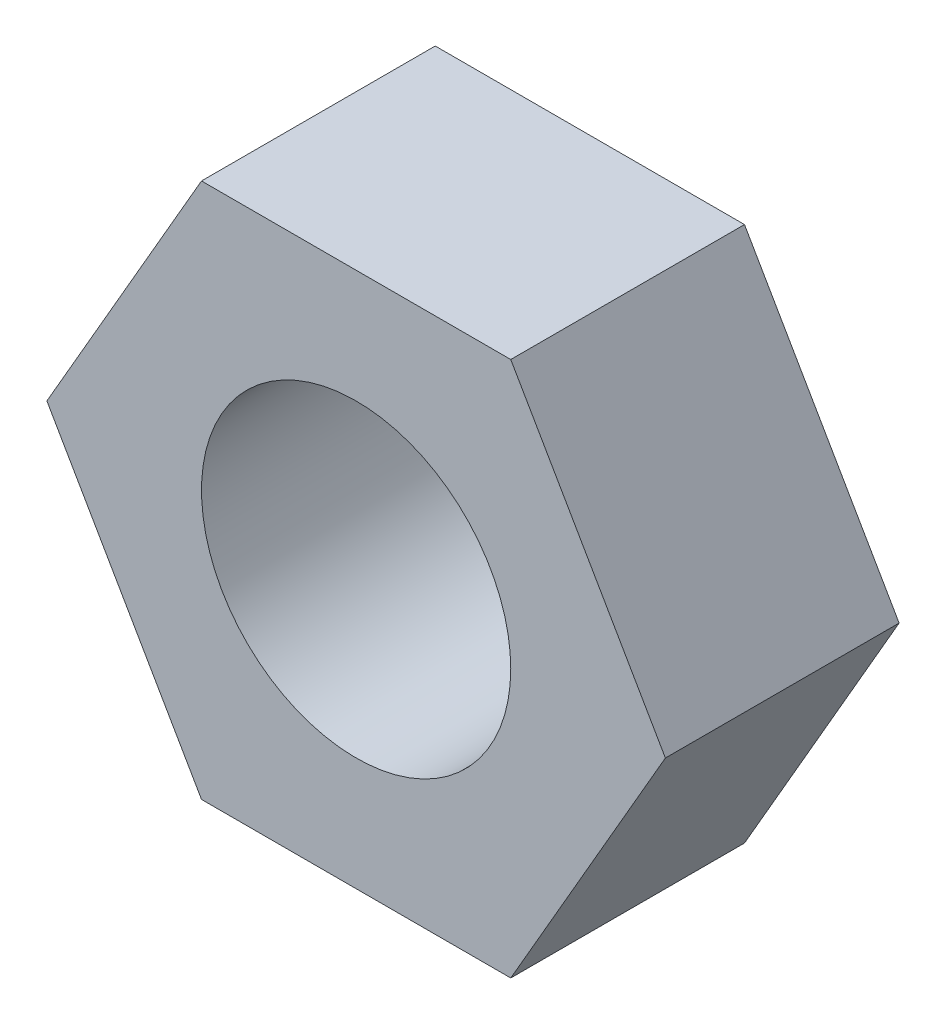
ISO-10303-21;
HEADER;
FILE_DESCRIPTION(('STEP AP214'),'2;1');
FILE_NAME('part.step','',(''),(''),'','','');
FILE_SCHEMA(('AUTOMOTIVE_DESIGN { 1 0 10303 214 1 1 1 1 }'));
ENDSEC;
DATA;
#1=APPLICATION_CONTEXT('core data for automotive mechanical design processes');
#2=APPLICATION_PROTOCOL_DEFINITION('international standard','automotive_design',2000,#1);
#3=PRODUCT_CONTEXT('',#1,'mechanical');
#4=PRODUCT('Part','Part','',(#3));
#5=PRODUCT_RELATED_PRODUCT_CATEGORY('part','',(#4));
#6=PRODUCT_DEFINITION_FORMATION('','',#4);
#7=PRODUCT_DEFINITION_CONTEXT('part definition',#1,'design');
#8=PRODUCT_DEFINITION('design','',#6,#7);
#9=PRODUCT_DEFINITION_SHAPE('','',#8);
#10=(LENGTH_UNIT() NAMED_UNIT(*) SI_UNIT(.MILLI.,.METRE.));
#11=(NAMED_UNIT(*) PLANE_ANGLE_UNIT() SI_UNIT($,.RADIAN.));
#12=(NAMED_UNIT(*) SI_UNIT($,.STERADIAN.) SOLID_ANGLE_UNIT());
#13=UNCERTAINTY_MEASURE_WITH_UNIT(LENGTH_MEASURE(1.E-05),#10,'distance_accuracy_value','');
#14=(GEOMETRIC_REPRESENTATION_CONTEXT(3) GLOBAL_UNCERTAINTY_ASSIGNED_CONTEXT((#13)) GLOBAL_UNIT_ASSIGNED_CONTEXT((#10,
#11,#12)) REPRESENTATION_CONTEXT('',''));
#15=CARTESIAN_POINT('',(0.,0.,0.));
#16=DIRECTION('',(0.,0.,1.));
#17=DIRECTION('',(1.,0.,0.));
#18=AXIS2_PLACEMENT_3D('',#15,#16,#17);
#19=CARTESIAN_POINT('',(0.,0.,2.4));
#20=DIRECTION('',(0.,0.,1.));
#21=DIRECTION('',(1.,0.,0.));
#22=AXIS2_PLACEMENT_3D('',#19,#20,#21);
#23=PLANE('',#22);
#24=DIRECTION('',(0.499999999999995,0.866025403784442,0.));
#25=VECTOR('',#24,1.);
#26=CARTESIAN_POINT('',(1.5877132402715,-2.74999999999998,2.4));
#27=LINE('',#26,#25);
#28=CARTESIAN_POINT('',(1.5877132402715,-2.74999999999998,2.4));
#29=VERTEX_POINT('',#28);
#30=CARTESIAN_POINT('',(3.17542648054294,0.,2.4));
#31=VERTEX_POINT('',#30);
#32=EDGE_CURVE('E131',#29,#31,#27,.T.);
#33=ORIENTED_EDGE('',*,*,#32,.T.);
#34=DIRECTION('',(-0.500000000000001,0.866025403784438,0.));
#35=VECTOR('',#34,1.);
#36=CARTESIAN_POINT('',(3.17542648054294,0.,2.4));
#37=LINE('',#36,#35);
#38=CARTESIAN_POINT('',(1.58771324027146,2.75,2.4));
#39=VERTEX_POINT('',#38);
#40=EDGE_CURVE('E89',#31,#39,#37,.T.);
#41=ORIENTED_EDGE('',*,*,#40,.T.);
#42=DIRECTION('',(-1.,0.,0.));
#43=VECTOR('',#42,1.);
#44=CARTESIAN_POINT('',(1.58771324027146,2.75,2.4));
#45=LINE('',#44,#43);
#46=CARTESIAN_POINT('',(-1.58771324027148,2.74999999999999,2.4));
#47=VERTEX_POINT('',#46);
#48=EDGE_CURVE('E102',#39,#47,#45,.T.);
#49=ORIENTED_EDGE('',*,*,#48,.T.);
#50=DIRECTION('',(-0.499999999999995,-0.866025403784442,0.));
#51=VECTOR('',#50,1.);
#52=CARTESIAN_POINT('',(-1.58771324027148,2.74999999999999,2.4));
#53=LINE('',#52,#51);
#54=CARTESIAN_POINT('',(-3.17542648054294,0.,2.4));
#55=VERTEX_POINT('',#54);
#56=EDGE_CURVE('E96',#47,#55,#53,.T.);
#57=ORIENTED_EDGE('',*,*,#56,.T.);
#58=DIRECTION('',(0.500000000000007,-0.866025403784435,0.));
#59=VECTOR('',#58,1.);
#60=CARTESIAN_POINT('',(-3.17542648054294,0.,2.4));
#61=LINE('',#60,#59);
#62=CARTESIAN_POINT('',(-1.58771324027145,-2.75000000000001,2.4));
#63=VERTEX_POINT('',#62);
#64=EDGE_CURVE('E100',#55,#63,#61,.T.);
#65=ORIENTED_EDGE('',*,*,#64,.T.);
#66=DIRECTION('',(1.,0.,0.));
#67=VECTOR('',#66,1.);
#68=CARTESIAN_POINT('',(-1.58771324027145,-2.75000000000001,2.4));
#69=LINE('',#68,#67);
#70=EDGE_CURVE('E52',#63,#29,#69,.T.);
#71=ORIENTED_EDGE('',*,*,#70,.T.);
#72=EDGE_LOOP('',(#33,#41,#49,#57,#65,#71));
#73=FACE_BOUND('',#72,.T.);
#74=CARTESIAN_POINT('',(0.,0.,2.4));
#75=DIRECTION('',(0.,0.,1.));
#76=DIRECTION('',(1.,0.,0.));
#77=AXIS2_PLACEMENT_3D('',#74,#75,#76);
#78=CIRCLE('',#77,1.5877132402715);
#79=CARTESIAN_POINT('',(1.5877132402715,0.,2.4));
#80=VERTEX_POINT('',#79);
#81=EDGE_CURVE('E124',#80,#80,#78,.T.);
#82=ORIENTED_EDGE('',*,*,#81,.F.);
#83=EDGE_LOOP('',(#82));
#84=FACE_BOUND('',#83,.T.);
#85=ADVANCED_FACE('F35',(#73,#84),#23,.T.);
#86=CARTESIAN_POINT('',(0.,0.,0.));
#87=DIRECTION('',(0.,0.,1.));
#88=DIRECTION('',(1.,0.,0.));
#89=AXIS2_PLACEMENT_3D('',#86,#87,#88);
#90=PLANE('',#89);
#91=DIRECTION('',(0.499999999999995,0.866025403784442,0.));
#92=VECTOR('',#91,1.);
#93=CARTESIAN_POINT('',(1.5877132402715,-2.74999999999998,0.));
#94=LINE('',#93,#92);
#95=CARTESIAN_POINT('',(1.5877132402715,-2.74999999999998,0.));
#96=VERTEX_POINT('',#95);
#97=CARTESIAN_POINT('',(3.17542648054294,0.,0.));
#98=VERTEX_POINT('',#97);
#99=EDGE_CURVE('E120',#96,#98,#94,.T.);
#100=ORIENTED_EDGE('',*,*,#99,.F.);
#101=DIRECTION('',(1.,0.,0.));
#102=VECTOR('',#101,1.);
#103=CARTESIAN_POINT('',(-1.58771324027145,-2.75000000000001,0.));
#104=LINE('',#103,#102);
#105=CARTESIAN_POINT('',(-1.58771324027145,-2.75000000000001,0.));
#106=VERTEX_POINT('',#105);
#107=EDGE_CURVE('E81',#106,#96,#104,.T.);
#108=ORIENTED_EDGE('',*,*,#107,.F.);
#109=DIRECTION('',(0.500000000000007,-0.866025403784435,0.));
#110=VECTOR('',#109,1.);
#111=CARTESIAN_POINT('',(-3.17542648054294,0.,0.));
#112=LINE('',#111,#110);
#113=CARTESIAN_POINT('',(-3.17542648054294,0.,0.));
#114=VERTEX_POINT('',#113);
#115=EDGE_CURVE('E75',#114,#106,#112,.T.);
#116=ORIENTED_EDGE('',*,*,#115,.F.);
#117=DIRECTION('',(-0.499999999999995,-0.866025403784442,0.));
#118=VECTOR('',#117,1.);
#119=CARTESIAN_POINT('',(-1.58771324027148,2.74999999999999,0.));
#120=LINE('',#119,#118);
#121=CARTESIAN_POINT('',(-1.58771324027148,2.74999999999999,0.));
#122=VERTEX_POINT('',#121);
#123=EDGE_CURVE('E110',#122,#114,#120,.T.);
#124=ORIENTED_EDGE('',*,*,#123,.F.);
#125=DIRECTION('',(-1.,0.,0.));
#126=VECTOR('',#125,1.);
#127=CARTESIAN_POINT('',(1.58771324027146,2.75,0.));
#128=LINE('',#127,#126);
#129=CARTESIAN_POINT('',(1.58771324027146,2.75,0.));
#130=VERTEX_POINT('',#129);
#131=EDGE_CURVE('E126',#130,#122,#128,.T.);
#132=ORIENTED_EDGE('',*,*,#131,.F.);
#133=DIRECTION('',(-0.500000000000001,0.866025403784438,0.));
#134=VECTOR('',#133,1.);
#135=CARTESIAN_POINT('',(3.17542648054294,0.,0.));
#136=LINE('',#135,#134);
#137=EDGE_CURVE('E123',#98,#130,#136,.T.);
#138=ORIENTED_EDGE('',*,*,#137,.F.);
#139=EDGE_LOOP('',(#100,#108,#116,#124,#132,#138));
#140=FACE_BOUND('',#139,.T.);
#141=CARTESIAN_POINT('',(0.,0.,0.));
#142=DIRECTION('',(0.,0.,1.));
#143=DIRECTION('',(1.,0.,0.));
#144=AXIS2_PLACEMENT_3D('',#141,#142,#143);
#145=CIRCLE('',#144,1.5877132402715);
#146=CARTESIAN_POINT('',(1.5877132402715,0.,0.));
#147=VERTEX_POINT('',#146);
#148=EDGE_CURVE('E224',#147,#147,#145,.T.);
#149=ORIENTED_EDGE('',*,*,#148,.T.);
#150=EDGE_LOOP('',(#149));
#151=FACE_BOUND('',#150,.T.);
#152=ADVANCED_FACE('F140',(#140,#151),#90,.F.);
#153=CARTESIAN_POINT('',(1.5877132402715,-2.74999999999998,2.4));
#154=DIRECTION('',(-0.866025403784441,0.499999999999995,0.));
#155=DIRECTION('',(-0.499999999999995,-0.866025403784442,0.));
#156=AXIS2_PLACEMENT_3D('',#153,#154,#155);
#157=PLANE('',#156);
#158=ORIENTED_EDGE('',*,*,#99,.T.);
#159=DIRECTION('',(0.,0.,-1.));
#160=VECTOR('',#159,1.);
#161=CARTESIAN_POINT('',(3.17542648054294,0.,2.4));
#162=LINE('',#161,#160);
#163=EDGE_CURVE('E11',#31,#98,#162,.T.);
#164=ORIENTED_EDGE('',*,*,#163,.F.);
#165=ORIENTED_EDGE('',*,*,#32,.F.);
#166=DIRECTION('',(0.,0.,-1.));
#167=VECTOR('',#166,1.);
#168=CARTESIAN_POINT('',(1.5877132402715,-2.74999999999998,2.4));
#169=LINE('',#168,#167);
#170=EDGE_CURVE('E116',#29,#96,#169,.T.);
#171=ORIENTED_EDGE('',*,*,#170,.T.);
#172=EDGE_LOOP('',(#158,#164,#165,#171));
#173=FACE_BOUND('',#172,.T.);
#174=ADVANCED_FACE('F37',(#173),#157,.F.);
#175=CARTESIAN_POINT('',(3.17542648054294,0.,2.4));
#176=DIRECTION('',(-0.866025403784438,-0.500000000000001,0.));
#177=DIRECTION('',(0.500000000000001,-0.866025403784438,0.));
#178=AXIS2_PLACEMENT_3D('',#175,#176,#177);
#179=PLANE('',#178);
#180=ORIENTED_EDGE('',*,*,#137,.T.);
#181=DIRECTION('',(0.,0.,-1.));
#182=VECTOR('',#181,1.);
#183=CARTESIAN_POINT('',(1.58771324027146,2.75,2.4));
#184=LINE('',#183,#182);
#185=EDGE_CURVE('E44',#39,#130,#184,.T.);
#186=ORIENTED_EDGE('',*,*,#185,.F.);
#187=ORIENTED_EDGE('',*,*,#40,.F.);
#188=ORIENTED_EDGE('',*,*,#163,.T.);
#189=EDGE_LOOP('',(#180,#186,#187,#188));
#190=FACE_BOUND('',#189,.T.);
#191=ADVANCED_FACE('F165',(#190),#179,.F.);
#192=CARTESIAN_POINT('',(1.58771324027146,2.75,2.4));
#193=DIRECTION('',(0.,-1.,0.));
#194=DIRECTION('',(1.,0.,0.));
#195=AXIS2_PLACEMENT_3D('',#192,#193,#194);
#196=PLANE('',#195);
#197=ORIENTED_EDGE('',*,*,#131,.T.);
#198=DIRECTION('',(0.,0.,-1.));
#199=VECTOR('',#198,1.);
#200=CARTESIAN_POINT('',(-1.58771324027148,2.74999999999999,2.4));
#201=LINE('',#200,#199);
#202=EDGE_CURVE('E111',#47,#122,#201,.T.);
#203=ORIENTED_EDGE('',*,*,#202,.F.);
#204=ORIENTED_EDGE('',*,*,#48,.F.);
#205=ORIENTED_EDGE('',*,*,#185,.T.);
#206=EDGE_LOOP('',(#197,#203,#204,#205));
#207=FACE_BOUND('',#206,.T.);
#208=ADVANCED_FACE('F137',(#207),#196,.F.);
#209=CARTESIAN_POINT('',(-1.58771324027148,2.74999999999999,2.4));
#210=DIRECTION('',(0.866025403784442,-0.499999999999995,0.));
#211=DIRECTION('',(0.499999999999995,0.866025403784442,0.));
#212=AXIS2_PLACEMENT_3D('',#209,#210,#211);
#213=PLANE('',#212);
#214=ORIENTED_EDGE('',*,*,#123,.T.);
#215=DIRECTION('',(0.,0.,-1.));
#216=VECTOR('',#215,1.);
#217=CARTESIAN_POINT('',(-3.17542648054294,0.,2.4));
#218=LINE('',#217,#216);
#219=EDGE_CURVE('E107',#55,#114,#218,.T.);
#220=ORIENTED_EDGE('',*,*,#219,.F.);
#221=ORIENTED_EDGE('',*,*,#56,.F.);
#222=ORIENTED_EDGE('',*,*,#202,.T.);
#223=EDGE_LOOP('',(#214,#220,#221,#222));
#224=FACE_BOUND('',#223,.T.);
#225=ADVANCED_FACE('F108',(#224),#213,.F.);
#226=CARTESIAN_POINT('',(-3.17542648054294,0.,2.4));
#227=DIRECTION('',(0.866025403784435,0.500000000000007,0.));
#228=DIRECTION('',(-0.500000000000007,0.866025403784435,0.));
#229=AXIS2_PLACEMENT_3D('',#226,#227,#228);
#230=PLANE('',#229);
#231=ORIENTED_EDGE('',*,*,#115,.T.);
#232=DIRECTION('',(0.,0.,-1.));
#233=VECTOR('',#232,1.);
#234=CARTESIAN_POINT('',(-1.58771324027145,-2.75000000000001,2.4));
#235=LINE('',#234,#233);
#236=EDGE_CURVE('E112',#63,#106,#235,.T.);
#237=ORIENTED_EDGE('',*,*,#236,.F.);
#238=ORIENTED_EDGE('',*,*,#64,.F.);
#239=ORIENTED_EDGE('',*,*,#219,.T.);
#240=EDGE_LOOP('',(#231,#237,#238,#239));
#241=FACE_BOUND('',#240,.T.);
#242=ADVANCED_FACE('F114',(#241),#230,.F.);
#243=CARTESIAN_POINT('',(-1.58771324027145,-2.75000000000001,2.4));
#244=DIRECTION('',(0.,1.,0.));
#245=DIRECTION('',(-1.,0.,0.));
#246=AXIS2_PLACEMENT_3D('',#243,#244,#245);
#247=PLANE('',#246);
#248=ORIENTED_EDGE('',*,*,#107,.T.);
#249=ORIENTED_EDGE('',*,*,#170,.F.);
#250=ORIENTED_EDGE('',*,*,#70,.F.);
#251=ORIENTED_EDGE('',*,*,#236,.T.);
#252=EDGE_LOOP('',(#248,#249,#250,#251));
#253=FACE_BOUND('',#252,.T.);
#254=ADVANCED_FACE('F145',(#253),#247,.F.);
#255=CARTESIAN_POINT('',(0.,0.,2.4));
#256=DIRECTION('',(0.,0.,-1.));
#257=DIRECTION('',(-1.,0.,0.));
#258=AXIS2_PLACEMENT_3D('',#255,#256,#257);
#259=CYLINDRICAL_SURFACE('',#258,1.5877132402715);
#260=ORIENTED_EDGE('',*,*,#81,.T.);
#261=EDGE_LOOP('',(#260));
#262=FACE_BOUND('',#261,.T.);
#263=ORIENTED_EDGE('',*,*,#148,.F.);
#264=EDGE_LOOP('',(#263));
#265=FACE_BOUND('',#264,.T.);
#266=ADVANCED_FACE('F147',(#262,#265),#259,.F.);
#267=CLOSED_SHELL('',(#85,#152,#174,#191,#208,#225,#242,#254,#266));
#268=MANIFOLD_SOLID_BREP('B2',#267);
#269=ADVANCED_BREP_SHAPE_REPRESENTATION('',(#18,#268),#14);
#270=SHAPE_DEFINITION_REPRESENTATION(#9,#269);
ENDSEC;
END-ISO-10303-21;
